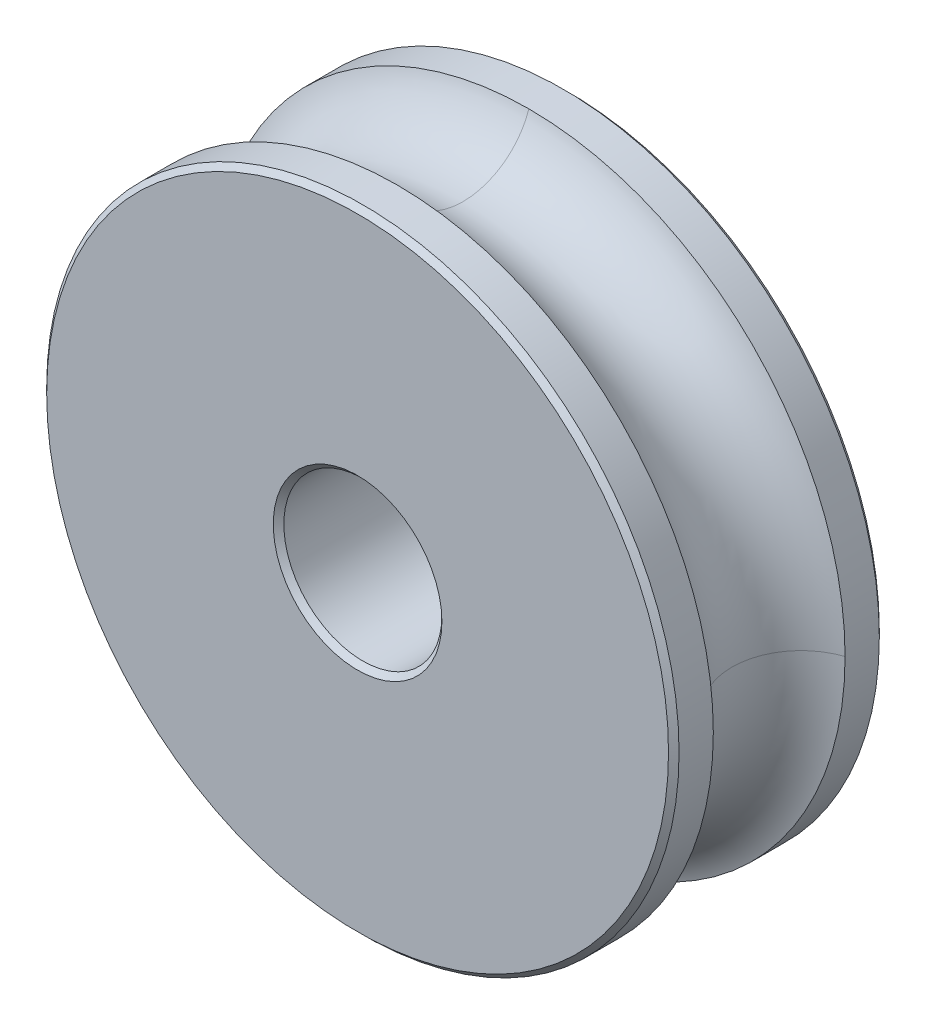
ISO-10303-21;
HEADER;
FILE_DESCRIPTION(('STEP AP214'),'2;1');
FILE_NAME('part.step','',(''),(''),'','','');
FILE_SCHEMA(('AUTOMOTIVE_DESIGN { 1 0 10303 214 1 1 1 1 }'));
ENDSEC;
DATA;
#1=APPLICATION_CONTEXT('core data for automotive mechanical design processes');
#2=APPLICATION_PROTOCOL_DEFINITION('international standard','automotive_design',2000,#1);
#3=PRODUCT_CONTEXT('',#1,'mechanical');
#4=PRODUCT('Part','Part','',(#3));
#5=PRODUCT_RELATED_PRODUCT_CATEGORY('part','',(#4));
#6=PRODUCT_DEFINITION_FORMATION('','',#4);
#7=PRODUCT_DEFINITION_CONTEXT('part definition',#1,'design');
#8=PRODUCT_DEFINITION('design','',#6,#7);
#9=PRODUCT_DEFINITION_SHAPE('','',#8);
#10=(LENGTH_UNIT() NAMED_UNIT(*) SI_UNIT(.MILLI.,.METRE.));
#11=(NAMED_UNIT(*) PLANE_ANGLE_UNIT() SI_UNIT($,.RADIAN.));
#12=(NAMED_UNIT(*) SI_UNIT($,.STERADIAN.) SOLID_ANGLE_UNIT());
#13=UNCERTAINTY_MEASURE_WITH_UNIT(LENGTH_MEASURE(1.E-05),#10,'distance_accuracy_value','');
#14=(GEOMETRIC_REPRESENTATION_CONTEXT(3) GLOBAL_UNCERTAINTY_ASSIGNED_CONTEXT((#13)) GLOBAL_UNIT_ASSIGNED_CONTEXT((#10,
#11,#12)) REPRESENTATION_CONTEXT('',''));
#15=CARTESIAN_POINT('',(0.,0.,0.));
#16=DIRECTION('',(0.,0.,1.));
#17=DIRECTION('',(1.,0.,0.));
#18=AXIS2_PLACEMENT_3D('',#15,#16,#17);
#19=CARTESIAN_POINT('',(0.,0.,2.));
#20=DIRECTION('',(0.,0.,-1.));
#21=DIRECTION('',(-1.,0.,0.));
#22=AXIS2_PLACEMENT_3D('',#19,#20,#21);
#23=CYLINDRICAL_SURFACE('',#22,6.);
#24=CARTESIAN_POINT('',(0.,0.,-1.9));
#25=DIRECTION('',(0.,0.,1.));
#26=DIRECTION('',(1.,0.,0.));
#27=AXIS2_PLACEMENT_3D('',#24,#25,#26);
#28=CIRCLE('',#27,6.);
#29=CARTESIAN_POINT('',(6.,0.,-1.9));
#30=VERTEX_POINT('',#29);
#31=EDGE_CURVE('E80',#30,#30,#28,.T.);
#32=ORIENTED_EDGE('',*,*,#31,.T.);
#33=EDGE_LOOP('',(#32));
#34=FACE_BOUND('',#33,.T.);
#35=CARTESIAN_POINT('',(0.,0.,-1.25));
#36=DIRECTION('',(0.,0.,-1.));
#37=DIRECTION('',(1.,0.,0.));
#38=AXIS2_PLACEMENT_3D('',#35,#36,#37);
#39=CIRCLE('',#38,6.);
#40=CARTESIAN_POINT('',(6.,0.,-1.25));
#41=VERTEX_POINT('',#40);
#42=CARTESIAN_POINT('',(0.,6.,-1.25));
#43=VERTEX_POINT('',#42);
#44=EDGE_CURVE('E68',#41,#43,#39,.T.);
#45=ORIENTED_EDGE('',*,*,#44,.T.);
#46=CARTESIAN_POINT('',(0.,0.,-1.25));
#47=DIRECTION('',(0.,0.,-1.));
#48=DIRECTION('',(0.,1.,0.));
#49=AXIS2_PLACEMENT_3D('',#46,#47,#48);
#50=CIRCLE('',#49,6.);
#51=EDGE_CURVE('E69',#43,#41,#50,.T.);
#52=ORIENTED_EDGE('',*,*,#51,.T.);
#53=EDGE_LOOP('',(#45,#52));
#54=FACE_BOUND('',#53,.T.);
#55=ADVANCED_FACE('F35',(#34,#54),#23,.T.);
#56=CARTESIAN_POINT('',(0.,0.,2.));
#57=DIRECTION('',(0.,0.,1.));
#58=DIRECTION('',(1.,0.,0.));
#59=AXIS2_PLACEMENT_3D('',#56,#57,#58);
#60=PLANE('',#59);
#61=CARTESIAN_POINT('',(0.,0.,2.));
#62=DIRECTION('',(0.,0.,1.));
#63=DIRECTION('',(1.,0.,0.));
#64=AXIS2_PLACEMENT_3D('',#61,#62,#63);
#65=CIRCLE('',#64,5.9);
#66=CARTESIAN_POINT('',(5.9,0.,2.));
#67=VERTEX_POINT('',#66);
#68=EDGE_CURVE('E93',#67,#67,#65,.T.);
#69=ORIENTED_EDGE('',*,*,#68,.T.);
#70=EDGE_LOOP('',(#69));
#71=FACE_BOUND('',#70,.T.);
#72=CARTESIAN_POINT('',(0.,0.,2.));
#73=DIRECTION('',(0.,0.,1.));
#74=DIRECTION('',(1.,0.,0.));
#75=AXIS2_PLACEMENT_3D('',#72,#73,#74);
#76=CIRCLE('',#75,1.6);
#77=CARTESIAN_POINT('',(1.6,0.,2.));
#78=VERTEX_POINT('',#77);
#79=EDGE_CURVE('E90',#78,#78,#76,.F.);
#80=ORIENTED_EDGE('',*,*,#79,.T.);
#81=EDGE_LOOP('',(#80));
#82=FACE_BOUND('',#81,.T.);
#83=ADVANCED_FACE('F110',(#71,#82),#60,.T.);
#84=CARTESIAN_POINT('',(0.,0.,-2.));
#85=DIRECTION('',(0.,0.,1.));
#86=DIRECTION('',(1.,0.,0.));
#87=AXIS2_PLACEMENT_3D('',#84,#85,#86);
#88=PLANE('',#87);
#89=CARTESIAN_POINT('',(0.,0.,-2.));
#90=DIRECTION('',(0.,0.,1.));
#91=DIRECTION('',(1.,0.,0.));
#92=AXIS2_PLACEMENT_3D('',#89,#90,#91);
#93=CIRCLE('',#92,5.9);
#94=CARTESIAN_POINT('',(5.9,0.,-2.));
#95=VERTEX_POINT('',#94);
#96=EDGE_CURVE('E87',#95,#95,#93,.F.);
#97=ORIENTED_EDGE('',*,*,#96,.T.);
#98=EDGE_LOOP('',(#97));
#99=FACE_BOUND('',#98,.T.);
#100=CARTESIAN_POINT('',(0.,0.,-2.));
#101=DIRECTION('',(0.,0.,1.));
#102=DIRECTION('',(1.,0.,0.));
#103=AXIS2_PLACEMENT_3D('',#100,#101,#102);
#104=CIRCLE('',#103,1.6);
#105=CARTESIAN_POINT('',(1.6,0.,-2.));
#106=VERTEX_POINT('',#105);
#107=EDGE_CURVE('E84',#106,#106,#104,.T.);
#108=ORIENTED_EDGE('',*,*,#107,.T.);
#109=EDGE_LOOP('',(#108));
#110=FACE_BOUND('',#109,.T.);
#111=ADVANCED_FACE('F108',(#99,#110),#88,.F.);
#112=CARTESIAN_POINT('',(0.,0.,1.9));
#113=DIRECTION('',(0.,0.,1.));
#114=DIRECTION('',(1.,0.,0.));
#115=AXIS2_PLACEMENT_3D('',#112,#113,#114);
#116=CIRCLE('',#115,6.);
#117=CARTESIAN_POINT('',(6.,0.,1.9));
#118=VERTEX_POINT('',#117);
#119=EDGE_CURVE('E96',#118,#118,#116,.F.);
#120=ORIENTED_EDGE('',*,*,#119,.T.);
#121=EDGE_LOOP('',(#120));
#122=FACE_BOUND('',#121,.T.);
#123=CARTESIAN_POINT('',(0.,0.,1.25));
#124=DIRECTION('',(0.,0.,-1.));
#125=DIRECTION('',(1.,0.,0.));
#126=AXIS2_PLACEMENT_3D('',#123,#124,#125);
#127=CIRCLE('',#126,6.);
#128=CARTESIAN_POINT('',(6.,0.,1.25));
#129=VERTEX_POINT('',#128);
#130=CARTESIAN_POINT('',(0.,6.,1.25));
#131=VERTEX_POINT('',#130);
#132=EDGE_CURVE('E64',#129,#131,#127,.T.);
#133=ORIENTED_EDGE('',*,*,#132,.F.);
#134=CARTESIAN_POINT('',(0.,0.,1.25));
#135=DIRECTION('',(0.,0.,-1.));
#136=DIRECTION('',(0.,1.,0.));
#137=AXIS2_PLACEMENT_3D('',#134,#135,#136);
#138=CIRCLE('',#137,6.);
#139=EDGE_CURVE('E58',#131,#129,#138,.T.);
#140=ORIENTED_EDGE('',*,*,#139,.F.);
#141=EDGE_LOOP('',(#133,#140));
#142=FACE_BOUND('',#141,.T.);
#143=ADVANCED_FACE('F75',(#122,#142),#23,.T.);
#144=CARTESIAN_POINT('',(0.,0.,2.));
#145=DIRECTION('',(0.,0.,-1.));
#146=DIRECTION('',(-1.,0.,0.));
#147=AXIS2_PLACEMENT_3D('',#144,#145,#146);
#148=CYLINDRICAL_SURFACE('',#147,1.5);
#149=CARTESIAN_POINT('',(0.,0.,1.9));
#150=DIRECTION('',(0.,0.,1.));
#151=DIRECTION('',(1.,0.,0.));
#152=AXIS2_PLACEMENT_3D('',#149,#150,#151);
#153=CIRCLE('',#152,1.5);
#154=CARTESIAN_POINT('',(1.5,0.,1.9));
#155=VERTEX_POINT('',#154);
#156=EDGE_CURVE('E11',#155,#155,#153,.T.);
#157=ORIENTED_EDGE('',*,*,#156,.T.);
#158=EDGE_LOOP('',(#157));
#159=FACE_BOUND('',#158,.T.);
#160=CARTESIAN_POINT('',(0.,0.,-1.9));
#161=DIRECTION('',(0.,0.,1.));
#162=DIRECTION('',(1.,0.,0.));
#163=AXIS2_PLACEMENT_3D('',#160,#161,#162);
#164=CIRCLE('',#163,1.5);
#165=CARTESIAN_POINT('',(1.5,0.,-1.9));
#166=VERTEX_POINT('',#165);
#167=EDGE_CURVE('E44',#166,#166,#164,.F.);
#168=ORIENTED_EDGE('',*,*,#167,.T.);
#169=EDGE_LOOP('',(#168));
#170=FACE_BOUND('',#169,.T.);
#171=ADVANCED_FACE('F101',(#159,#170),#148,.F.);
#172=CARTESIAN_POINT('',(0.,0.,0.));
#173=DIRECTION('',(0.,0.,-1.));
#174=DIRECTION('',(-1.,0.,0.));
#175=AXIS2_PLACEMENT_3D('',#172,#173,#174);
#176=TOROIDAL_SURFACE('',#175,6.41805555555556,1.31805555555556);
#177=ORIENTED_EDGE('',*,*,#51,.F.);
#178=CARTESIAN_POINT('',(0.,6.41805555555556,0.));
#179=DIRECTION('',(1.,0.,0.));
#180=DIRECTION('',(0.,0.,-1.));
#181=AXIS2_PLACEMENT_3D('',#178,#179,#180);
#182=CIRCLE('',#181,1.31805555555556);
#183=EDGE_CURVE('E51',#131,#43,#182,.T.);
#184=ORIENTED_EDGE('',*,*,#183,.F.);
#185=ORIENTED_EDGE('',*,*,#139,.T.);
#186=CARTESIAN_POINT('',(6.41805555555556,0.,0.));
#187=DIRECTION('',(0.,-1.,0.));
#188=DIRECTION('',(0.,0.,-1.));
#189=AXIS2_PLACEMENT_3D('',#186,#187,#188);
#190=CIRCLE('',#189,1.31805555555556);
#191=EDGE_CURVE('E66',#129,#41,#190,.T.);
#192=ORIENTED_EDGE('',*,*,#191,.T.);
#193=EDGE_LOOP('',(#177,#184,#185,#192));
#194=FACE_BOUND('',#193,.T.);
#195=ADVANCED_FACE('F71',(#194),#176,.F.);
#196=CARTESIAN_POINT('',(0.,0.,0.));
#197=DIRECTION('',(0.,0.,-1.));
#198=DIRECTION('',(-1.,0.,0.));
#199=AXIS2_PLACEMENT_3D('',#196,#197,#198);
#200=TOROIDAL_SURFACE('',#199,6.41805555555556,1.31805555555556);
#201=ORIENTED_EDGE('',*,*,#183,.T.);
#202=ORIENTED_EDGE('',*,*,#44,.F.);
#203=ORIENTED_EDGE('',*,*,#191,.F.);
#204=ORIENTED_EDGE('',*,*,#132,.T.);
#205=EDGE_LOOP('',(#201,#202,#203,#204));
#206=FACE_BOUND('',#205,.T.);
#207=ADVANCED_FACE('F65',(#206),#200,.F.);
#208=CARTESIAN_POINT('',(0.,0.,-1.9));
#209=DIRECTION('',(0.,0.,1.));
#210=DIRECTION('',(1.,0.,0.));
#211=AXIS2_PLACEMENT_3D('',#208,#209,#210);
#212=CONICAL_SURFACE('',#211,6.,0.785398163397444);
#213=ORIENTED_EDGE('',*,*,#96,.F.);
#214=EDGE_LOOP('',(#213));
#215=FACE_BOUND('',#214,.T.);
#216=ORIENTED_EDGE('',*,*,#31,.F.);
#217=EDGE_LOOP('',(#216));
#218=FACE_BOUND('',#217,.T.);
#219=ADVANCED_FACE('F128',(#215,#218),#212,.T.);
#220=CARTESIAN_POINT('',(0.,0.,2.));
#221=DIRECTION('',(0.,0.,-1.));
#222=DIRECTION('',(-1.,0.,0.));
#223=AXIS2_PLACEMENT_3D('',#220,#221,#222);
#224=CONICAL_SURFACE('',#223,5.9,0.785398163397435);
#225=ORIENTED_EDGE('',*,*,#119,.F.);
#226=EDGE_LOOP('',(#225));
#227=FACE_BOUND('',#226,.T.);
#228=ORIENTED_EDGE('',*,*,#68,.F.);
#229=EDGE_LOOP('',(#228));
#230=FACE_BOUND('',#229,.T.);
#231=ADVANCED_FACE('F134',(#227,#230),#224,.T.);
#232=CARTESIAN_POINT('',(0.,0.,1.9));
#233=DIRECTION('',(0.,0.,1.));
#234=DIRECTION('',(1.,0.,0.));
#235=AXIS2_PLACEMENT_3D('',#232,#233,#234);
#236=CONICAL_SURFACE('',#235,1.5,0.785398163397442);
#237=ORIENTED_EDGE('',*,*,#79,.F.);
#238=EDGE_LOOP('',(#237));
#239=FACE_BOUND('',#238,.T.);
#240=ORIENTED_EDGE('',*,*,#156,.F.);
#241=EDGE_LOOP('',(#240));
#242=FACE_BOUND('',#241,.T.);
#243=ADVANCED_FACE('F105',(#239,#242),#236,.F.);
#244=CARTESIAN_POINT('',(0.,0.,-2.));
#245=DIRECTION('',(0.,0.,-1.));
#246=DIRECTION('',(-1.,0.,0.));
#247=AXIS2_PLACEMENT_3D('',#244,#245,#246);
#248=CONICAL_SURFACE('',#247,1.6,0.785398163397446);
#249=ORIENTED_EDGE('',*,*,#167,.F.);
#250=EDGE_LOOP('',(#249));
#251=FACE_BOUND('',#250,.T.);
#252=ORIENTED_EDGE('',*,*,#107,.F.);
#253=EDGE_LOOP('',(#252));
#254=FACE_BOUND('',#253,.T.);
#255=ADVANCED_FACE('F38',(#251,#254),#248,.F.);
#256=CLOSED_SHELL('',(#55,#83,#111,#143,#171,#195,#207,#219,#231,#243,#255));
#257=MANIFOLD_SOLID_BREP('B2',#256);
#258=ADVANCED_BREP_SHAPE_REPRESENTATION('',(#18,#257),#14);
#259=SHAPE_DEFINITION_REPRESENTATION(#9,#258);
ENDSEC;
END-ISO-10303-21;
